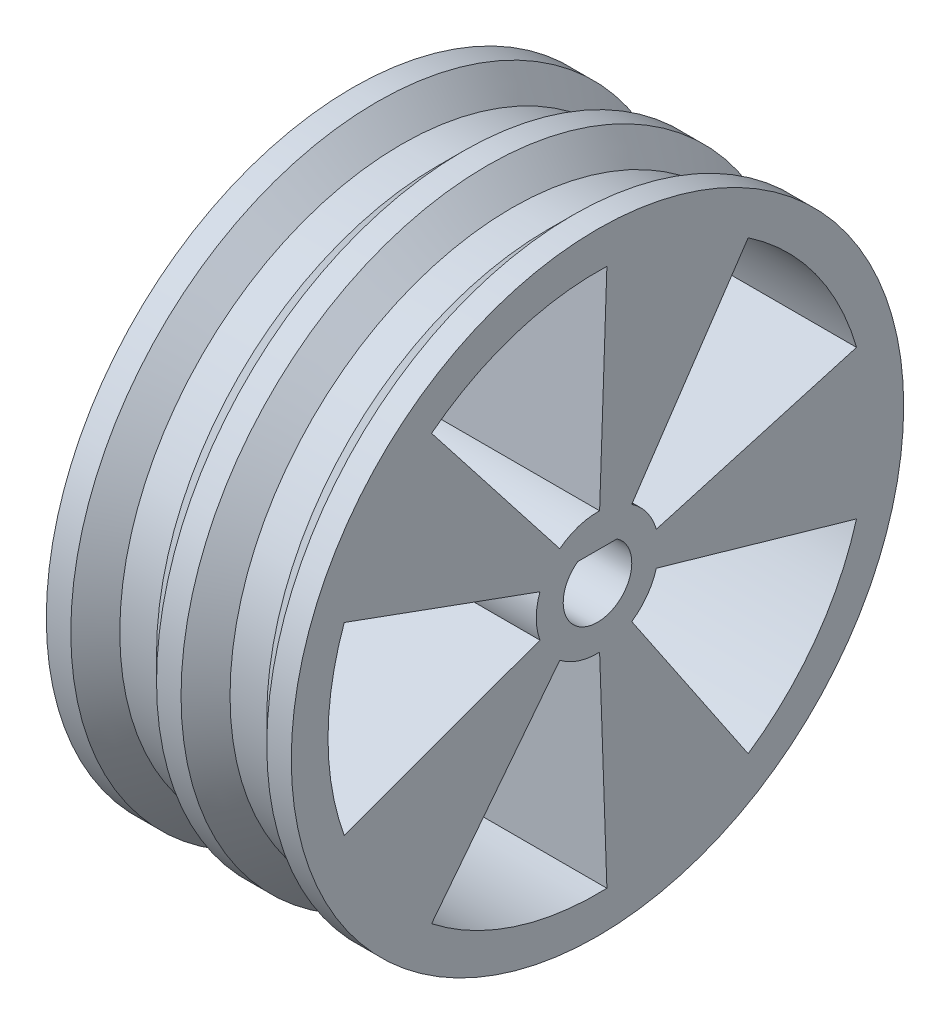
ISO-10303-21;
HEADER;
FILE_DESCRIPTION(('STEP AP214'),'2;1');
FILE_NAME('part.step','',(''),(''),'','','');
FILE_SCHEMA(('AUTOMOTIVE_DESIGN { 1 0 10303 214 1 1 1 1 }'));
ENDSEC;
DATA;
#1=APPLICATION_CONTEXT('core data for automotive mechanical design processes');
#2=APPLICATION_PROTOCOL_DEFINITION('international standard','automotive_design',2000,#1);
#3=PRODUCT_CONTEXT('',#1,'mechanical');
#4=PRODUCT('Part','Part','',(#3));
#5=PRODUCT_RELATED_PRODUCT_CATEGORY('part','',(#4));
#6=PRODUCT_DEFINITION_FORMATION('','',#4);
#7=PRODUCT_DEFINITION_CONTEXT('part definition',#1,'design');
#8=PRODUCT_DEFINITION('design','',#6,#7);
#9=PRODUCT_DEFINITION_SHAPE('','',#8);
#10=(LENGTH_UNIT() NAMED_UNIT(*) SI_UNIT(.MILLI.,.METRE.));
#11=(NAMED_UNIT(*) PLANE_ANGLE_UNIT() SI_UNIT($,.RADIAN.));
#12=(NAMED_UNIT(*) SI_UNIT($,.STERADIAN.) SOLID_ANGLE_UNIT());
#13=UNCERTAINTY_MEASURE_WITH_UNIT(LENGTH_MEASURE(1.E-05),#10,'distance_accuracy_value','');
#14=(GEOMETRIC_REPRESENTATION_CONTEXT(3) GLOBAL_UNCERTAINTY_ASSIGNED_CONTEXT((#13)) GLOBAL_UNIT_ASSIGNED_CONTEXT((#10,
#11,#12)) REPRESENTATION_CONTEXT('',''));
#15=CARTESIAN_POINT('',(0.,0.,0.));
#16=DIRECTION('',(0.,0.,1.));
#17=DIRECTION('',(1.,0.,0.));
#18=AXIS2_PLACEMENT_3D('',#15,#16,#17);
#19=CARTESIAN_POINT('',(-10.,0.,0.));
#20=DIRECTION('',(1.,0.,0.));
#21=DIRECTION('',(0.,0.,-1.));
#22=AXIS2_PLACEMENT_3D('',#19,#20,#21);
#23=CYLINDRICAL_SURFACE('',#22,2.8);
#24=CARTESIAN_POINT('',(-6.,0.,0.));
#25=DIRECTION('',(-1.,0.,0.));
#26=DIRECTION('',(0.,0.,1.));
#27=AXIS2_PLACEMENT_3D('',#24,#25,#26);
#28=CIRCLE('',#27,2.8);
#29=CARTESIAN_POINT('',(-6.,2.3,1.59687194226713));
#30=VERTEX_POINT('',#29);
#31=CARTESIAN_POINT('',(-6.,2.3,-1.59687194226713));
#32=VERTEX_POINT('',#31);
#33=EDGE_CURVE('E97',#30,#32,#28,.F.);
#34=ORIENTED_EDGE('',*,*,#33,.F.);
#35=DIRECTION('',(1.,0.,0.));
#36=VECTOR('',#35,1.);
#37=CARTESIAN_POINT('',(-10.,2.3,1.59687194226713));
#38=LINE('',#37,#36);
#39=CARTESIAN_POINT('',(10.,2.3,1.59687194226713));
#40=VERTEX_POINT('',#39);
#41=EDGE_CURVE('E239',#30,#40,#38,.T.);
#42=ORIENTED_EDGE('',*,*,#41,.T.);
#43=CARTESIAN_POINT('',(10.,0.,0.));
#44=DIRECTION('',(1.,0.,0.));
#45=DIRECTION('',(0.,0.,-1.));
#46=AXIS2_PLACEMENT_3D('',#43,#44,#45);
#47=CIRCLE('',#46,2.8);
#48=CARTESIAN_POINT('',(10.,2.3,-1.59687194226713));
#49=VERTEX_POINT('',#48);
#50=EDGE_CURVE('E387',#40,#49,#47,.T.);
#51=ORIENTED_EDGE('',*,*,#50,.T.);
#52=DIRECTION('',(1.,0.,0.));
#53=VECTOR('',#52,1.);
#54=CARTESIAN_POINT('',(-10.,2.3,-1.59687194226713));
#55=LINE('',#54,#53);
#56=EDGE_CURVE('E241',#32,#49,#55,.T.);
#57=ORIENTED_EDGE('',*,*,#56,.F.);
#58=EDGE_LOOP('',(#34,#42,#51,#57));
#59=FACE_BOUND('',#58,.T.);
#60=ADVANCED_FACE('F83',(#59),#23,.F.);
#61=CARTESIAN_POINT('',(-10.,2.3,1.59687194226713));
#62=DIRECTION('',(0.,1.,0.));
#63=DIRECTION('',(0.,0.,1.));
#64=AXIS2_PLACEMENT_3D('',#61,#62,#63);
#65=PLANE('',#64);
#66=DIRECTION('',(0.,0.,1.));
#67=VECTOR('',#66,1.);
#68=CARTESIAN_POINT('',(-6.,2.3,1.59687194226713));
#69=LINE('',#68,#67);
#70=EDGE_CURVE('E229',#32,#30,#69,.T.);
#71=ORIENTED_EDGE('',*,*,#70,.F.);
#72=ORIENTED_EDGE('',*,*,#56,.T.);
#73=DIRECTION('',(0.,0.,1.));
#74=VECTOR('',#73,1.);
#75=CARTESIAN_POINT('',(10.,2.3,1.59687194226713));
#76=LINE('',#75,#74);
#77=EDGE_CURVE('E247',#49,#40,#76,.T.);
#78=ORIENTED_EDGE('',*,*,#77,.T.);
#79=ORIENTED_EDGE('',*,*,#41,.F.);
#80=EDGE_LOOP('',(#71,#72,#78,#79));
#81=FACE_BOUND('',#80,.T.);
#82=ADVANCED_FACE('F245',(#81),#65,.F.);
#83=CARTESIAN_POINT('',(-10.,0.,0.));
#84=DIRECTION('',(1.,0.,0.));
#85=DIRECTION('',(0.,0.,-1.));
#86=AXIS2_PLACEMENT_3D('',#83,#84,#85);
#87=PLANE('',#86);
#88=CARTESIAN_POINT('',(-10.,0.,0.));
#89=DIRECTION('',(-1.,0.,0.));
#90=DIRECTION('',(0.,0.,1.));
#91=AXIS2_PLACEMENT_3D('',#88,#89,#90);
#92=CIRCLE('',#91,3.);
#93=CARTESIAN_POINT('',(-10.,0.,3.));
#94=VERTEX_POINT('',#93);
#95=EDGE_CURVE('E729',#94,#94,#92,.T.);
#96=ORIENTED_EDGE('',*,*,#95,.F.);
#97=EDGE_LOOP('',(#96));
#98=FACE_BOUND('',#97,.T.);
#99=CARTESIAN_POINT('',(-10.,0.,0.));
#100=DIRECTION('',(1.,0.,0.));
#101=DIRECTION('',(0.,0.,-1.));
#102=AXIS2_PLACEMENT_3D('',#99,#100,#101);
#103=CIRCLE('',#102,5.);
#104=CARTESIAN_POINT('',(-10.,-4.99695413509548,-0.174497483512452));
#105=VERTEX_POINT('',#104);
#106=CARTESIAN_POINT('',(-10.,-3.94005376803357,3.07830737662834));
#107=VERTEX_POINT('',#106);
#108=EDGE_CURVE('E736',#105,#107,#103,.F.);
#109=ORIENTED_EDGE('',*,*,#108,.T.);
#110=DIRECTION('',(0.,0.788010753606723,-0.615661475325657));
#111=VECTOR('',#110,1.);
#112=CARTESIAN_POINT('',(-10.,0.,0.));
#113=LINE('',#112,#111);
#114=CARTESIAN_POINT('',(-10.,-17.3362365793479,13.5445524571645));
#115=VERTEX_POINT('',#114);
#116=EDGE_CURVE('E740',#115,#107,#113,.T.);
#117=ORIENTED_EDGE('',*,*,#116,.F.);
#118=CARTESIAN_POINT('',(-10.,0.,0.));
#119=DIRECTION('',(1.,0.,0.));
#120=DIRECTION('',(0.,0.,-1.));
#121=AXIS2_PLACEMENT_3D('',#118,#119,#120);
#122=CIRCLE('',#121,22.);
#123=CARTESIAN_POINT('',(-10.,-21.9865981944201,-0.767788927455052));
#124=VERTEX_POINT('',#123);
#125=EDGE_CURVE('E742',#124,#115,#122,.F.);
#126=ORIENTED_EDGE('',*,*,#125,.F.);
#127=DIRECTION('',(0.,0.999390827019096,0.0348994967025059));
#128=VECTOR('',#127,1.);
#129=CARTESIAN_POINT('',(-10.,0.,0.));
#130=LINE('',#129,#128);
#131=EDGE_CURVE('E733',#124,#105,#130,.T.);
#132=ORIENTED_EDGE('',*,*,#131,.T.);
#133=EDGE_LOOP('',(#109,#117,#126,#132));
#134=FACE_BOUND('',#133,.T.);
#135=CARTESIAN_POINT('',(-10.,0.,0.));
#136=DIRECTION('',(1.,0.,0.));
#137=DIRECTION('',(0.,0.,-1.));
#138=AXIS2_PLACEMENT_3D('',#135,#136,#137);
#139=CIRCLE('',#138,5.);
#140=CARTESIAN_POINT('',(-10.,-1.37818677908506,-4.8063084796917));
#141=VERTEX_POINT('',#140);
#142=CARTESIAN_POINT('',(-10.,-4.14518786277518,-2.79596451735377));
#143=VERTEX_POINT('',#142);
#144=EDGE_CURVE('E762',#141,#143,#139,.F.);
#145=ORIENTED_EDGE('',*,*,#144,.T.);
#146=DIRECTION('',(0.,0.829037572555044,0.559192903470743));
#147=VECTOR('',#146,1.);
#148=CARTESIAN_POINT('',(-10.,0.,0.));
#149=LINE('',#148,#147);
#150=CARTESIAN_POINT('',(-10.,-18.2388265962109,-12.3022438763564));
#151=VERTEX_POINT('',#150);
#152=EDGE_CURVE('E766',#151,#143,#149,.T.);
#153=ORIENTED_EDGE('',*,*,#152,.F.);
#154=CARTESIAN_POINT('',(-10.,0.,0.));
#155=DIRECTION('',(1.,0.,0.));
#156=DIRECTION('',(0.,0.,-1.));
#157=AXIS2_PLACEMENT_3D('',#154,#155,#156);
#158=CIRCLE('',#157,22.);
#159=CARTESIAN_POINT('',(-10.,-6.06402182797396,-21.147757310643));
#160=VERTEX_POINT('',#159);
#161=EDGE_CURVE('E768',#160,#151,#158,.F.);
#162=ORIENTED_EDGE('',*,*,#161,.F.);
#163=DIRECTION('',(0.,0.275637355816996,0.96126169593832));
#164=VECTOR('',#163,1.);
#165=CARTESIAN_POINT('',(-10.,0.,0.));
#166=LINE('',#165,#164);
#167=EDGE_CURVE('E759',#160,#141,#166,.T.);
#168=ORIENTED_EDGE('',*,*,#167,.T.);
#169=EDGE_LOOP('',(#145,#153,#162,#168));
#170=FACE_BOUND('',#169,.T.);
#171=CARTESIAN_POINT('',(-10.,0.,0.));
#172=DIRECTION('',(1.,0.,0.));
#173=DIRECTION('',(0.,0.,-1.));
#174=AXIS2_PLACEMENT_3D('',#171,#172,#173);
#175=CIRCLE('',#174,5.);
#176=CARTESIAN_POINT('',(-10.,4.14518786277522,-2.79596451735385));
#177=VERTEX_POINT('',#176);
#178=CARTESIAN_POINT('',(-10.,1.37818677908497,-4.8063084796916));
#179=VERTEX_POINT('',#178);
#180=EDGE_CURVE('E790',#177,#179,#175,.F.);
#181=ORIENTED_EDGE('',*,*,#180,.T.);
#182=DIRECTION('',(0.,-0.275637355816999,0.961261695938319));
#183=VECTOR('',#182,1.);
#184=CARTESIAN_POINT('',(-10.,0.,0.));
#185=LINE('',#184,#183);
#186=CARTESIAN_POINT('',(-10.,6.06402182797396,-21.147757310643));
#187=VERTEX_POINT('',#186);
#188=EDGE_CURVE('E794',#187,#179,#185,.T.);
#189=ORIENTED_EDGE('',*,*,#188,.F.);
#190=CARTESIAN_POINT('',(-10.,0.,0.));
#191=DIRECTION('',(1.,0.,0.));
#192=DIRECTION('',(0.,0.,-1.));
#193=AXIS2_PLACEMENT_3D('',#190,#191,#192);
#194=CIRCLE('',#193,22.);
#195=CARTESIAN_POINT('',(-10.,18.2388265962109,-12.3022438763564));
#196=VERTEX_POINT('',#195);
#197=EDGE_CURVE('E429',#196,#187,#194,.F.);
#198=ORIENTED_EDGE('',*,*,#197,.F.);
#199=DIRECTION('',(0.,-0.829037572555046,0.559192903470741));
#200=VECTOR('',#199,1.);
#201=CARTESIAN_POINT('',(-10.,0.,-1.04985018589199E-13));
#202=LINE('',#201,#200);
#203=EDGE_CURVE('E787',#196,#177,#202,.T.);
#204=ORIENTED_EDGE('',*,*,#203,.T.);
#205=EDGE_LOOP('',(#181,#189,#198,#204));
#206=FACE_BOUND('',#205,.T.);
#207=CARTESIAN_POINT('',(-10.,0.,0.));
#208=DIRECTION('',(1.,0.,0.));
#209=DIRECTION('',(0.,0.,-1.));
#210=AXIS2_PLACEMENT_3D('',#207,#208,#209);
#211=CIRCLE('',#210,5.);
#212=CARTESIAN_POINT('',(-10.,3.9400537680336,3.0783073766283));
#213=VERTEX_POINT('',#212);
#214=CARTESIAN_POINT('',(-10.,4.99695413509548,-0.174497483512522));
#215=VERTEX_POINT('',#214);
#216=EDGE_CURVE('E417',#213,#215,#211,.F.);
#217=ORIENTED_EDGE('',*,*,#216,.T.);
#218=DIRECTION('',(0.,-0.999390827019096,0.0348994967025015));
#219=VECTOR('',#218,1.);
#220=CARTESIAN_POINT('',(-10.,0.,0.));
#221=LINE('',#220,#219);
#222=CARTESIAN_POINT('',(-10.,21.9865981944201,-0.767788927455048));
#223=VERTEX_POINT('',#222);
#224=EDGE_CURVE('E412',#223,#215,#221,.T.);
#225=ORIENTED_EDGE('',*,*,#224,.F.);
#226=CARTESIAN_POINT('',(-10.,0.,0.));
#227=DIRECTION('',(1.,0.,0.));
#228=DIRECTION('',(0.,0.,-1.));
#229=AXIS2_PLACEMENT_3D('',#226,#227,#228);
#230=CIRCLE('',#229,22.);
#231=CARTESIAN_POINT('',(-10.,17.3362365793479,13.5445524571645));
#232=VERTEX_POINT('',#231);
#233=EDGE_CURVE('E408',#232,#223,#230,.F.);
#234=ORIENTED_EDGE('',*,*,#233,.F.);
#235=DIRECTION('',(0.,-0.788010753606721,-0.615661475325659));
#236=VECTOR('',#235,1.);
#237=CARTESIAN_POINT('',(-10.,0.,0.));
#238=LINE('',#237,#236);
#239=EDGE_CURVE('E423',#232,#213,#238,.T.);
#240=ORIENTED_EDGE('',*,*,#239,.T.);
#241=EDGE_LOOP('',(#217,#225,#234,#240));
#242=FACE_BOUND('',#241,.T.);
#243=CARTESIAN_POINT('',(-10.,0.,0.));
#244=DIRECTION('',(1.,0.,0.));
#245=DIRECTION('',(0.,0.,-1.));
#246=AXIS2_PLACEMENT_3D('',#243,#244,#245);
#247=CIRCLE('',#246,25.);
#248=CARTESIAN_POINT('',(-10.,0.,-25.));
#249=VERTEX_POINT('',#248);
#250=EDGE_CURVE('E235',#249,#249,#247,.T.);
#251=ORIENTED_EDGE('',*,*,#250,.F.);
#252=EDGE_LOOP('',(#251));
#253=FACE_BOUND('',#252,.T.);
#254=DIRECTION('',(0.,0.34202014332567,-0.939692620785908));
#255=VECTOR('',#254,1.);
#256=CARTESIAN_POINT('',(-10.,0.,0.));
#257=LINE('',#256,#255);
#258=CARTESIAN_POINT('',(-10.,-7.52444315316474,20.67323765729));
#259=VERTEX_POINT('',#258);
#260=CARTESIAN_POINT('',(-10.,-1.71010071662835,4.69846310392954));
#261=VERTEX_POINT('',#260);
#262=EDGE_CURVE('E370',#259,#261,#257,.T.);
#263=ORIENTED_EDGE('',*,*,#262,.T.);
#264=CARTESIAN_POINT('',(-10.,0.,0.));
#265=DIRECTION('',(1.,0.,0.));
#266=DIRECTION('',(0.,0.,-1.));
#267=AXIS2_PLACEMENT_3D('',#264,#265,#266);
#268=CIRCLE('',#267,5.);
#269=CARTESIAN_POINT('',(-10.,1.71010071662835,4.69846310392954));
#270=VERTEX_POINT('',#269);
#271=EDGE_CURVE('E378',#261,#270,#268,.F.);
#272=ORIENTED_EDGE('',*,*,#271,.T.);
#273=DIRECTION('',(0.,-0.34202014332567,-0.939692620785908));
#274=VECTOR('',#273,1.);
#275=CARTESIAN_POINT('',(-10.,0.,0.));
#276=LINE('',#275,#274);
#277=CARTESIAN_POINT('',(-10.,7.52444315316474,20.67323765729));
#278=VERTEX_POINT('',#277);
#279=EDGE_CURVE('E404',#278,#270,#276,.T.);
#280=ORIENTED_EDGE('',*,*,#279,.F.);
#281=CARTESIAN_POINT('',(-10.,0.,0.));
#282=DIRECTION('',(1.,0.,0.));
#283=DIRECTION('',(0.,0.,-1.));
#284=AXIS2_PLACEMENT_3D('',#281,#282,#283);
#285=CIRCLE('',#284,22.);
#286=EDGE_CURVE('E385',#259,#278,#285,.F.);
#287=ORIENTED_EDGE('',*,*,#286,.F.);
#288=EDGE_LOOP('',(#263,#272,#280,#287));
#289=FACE_BOUND('',#288,.T.);
#290=ADVANCED_FACE('F280',(#98,#134,#170,#206,#242,#253,#289),#87,.F.);
#291=CARTESIAN_POINT('',(10.,0.,0.));
#292=DIRECTION('',(1.,0.,0.));
#293=DIRECTION('',(0.,0.,-1.));
#294=AXIS2_PLACEMENT_3D('',#291,#292,#293);
#295=PLANE('',#294);
#296=DIRECTION('',(0.,-0.788010753606723,0.615661475325657));
#297=VECTOR('',#296,1.);
#298=CARTESIAN_POINT('',(10.,0.,0.));
#299=LINE('',#298,#297);
#300=CARTESIAN_POINT('',(10.,-3.94005376803357,3.07830737662834));
#301=VERTEX_POINT('',#300);
#302=CARTESIAN_POINT('',(10.,-17.3362365793479,13.5445524571645));
#303=VERTEX_POINT('',#302);
#304=EDGE_CURVE('E242',#301,#303,#299,.T.);
#305=ORIENTED_EDGE('',*,*,#304,.F.);
#306=CARTESIAN_POINT('',(10.,0.,0.));
#307=DIRECTION('',(1.,0.,0.));
#308=DIRECTION('',(0.,0.,-1.));
#309=AXIS2_PLACEMENT_3D('',#306,#307,#308);
#310=CIRCLE('',#309,5.);
#311=CARTESIAN_POINT('',(10.,-4.99695413509548,-0.174497483512452));
#312=VERTEX_POINT('',#311);
#313=EDGE_CURVE('E749',#301,#312,#310,.T.);
#314=ORIENTED_EDGE('',*,*,#313,.T.);
#315=DIRECTION('',(0.,-0.999390827019096,-0.0348994967025059));
#316=VECTOR('',#315,1.);
#317=CARTESIAN_POINT('',(10.,0.,0.));
#318=LINE('',#317,#316);
#319=CARTESIAN_POINT('',(10.,-21.9865981944201,-0.767788927455052));
#320=VERTEX_POINT('',#319);
#321=EDGE_CURVE('E746',#312,#320,#318,.T.);
#322=ORIENTED_EDGE('',*,*,#321,.T.);
#323=CARTESIAN_POINT('',(10.,0.,0.));
#324=DIRECTION('',(1.,0.,0.));
#325=DIRECTION('',(0.,0.,-1.));
#326=AXIS2_PLACEMENT_3D('',#323,#324,#325);
#327=CIRCLE('',#326,22.);
#328=EDGE_CURVE('E744',#303,#320,#327,.T.);
#329=ORIENTED_EDGE('',*,*,#328,.F.);
#330=EDGE_LOOP('',(#305,#314,#322,#329));
#331=FACE_BOUND('',#330,.T.);
#332=DIRECTION('',(0.,-0.829037572555044,-0.559192903470743));
#333=VECTOR('',#332,1.);
#334=CARTESIAN_POINT('',(10.,0.,0.));
#335=LINE('',#334,#333);
#336=CARTESIAN_POINT('',(10.,-4.14518786277528,-2.79596451735384));
#337=VERTEX_POINT('',#336);
#338=CARTESIAN_POINT('',(10.,-18.2388265962109,-12.3022438763564));
#339=VERTEX_POINT('',#338);
#340=EDGE_CURVE('E334',#337,#339,#335,.T.);
#341=ORIENTED_EDGE('',*,*,#340,.F.);
#342=CARTESIAN_POINT('',(10.,0.,0.));
#343=DIRECTION('',(1.,0.,0.));
#344=DIRECTION('',(0.,0.,-1.));
#345=AXIS2_PLACEMENT_3D('',#342,#343,#344);
#346=CIRCLE('',#345,5.);
#347=CARTESIAN_POINT('',(10.,-1.37818677908506,-4.8063084796917));
#348=VERTEX_POINT('',#347);
#349=EDGE_CURVE('E776',#337,#348,#346,.T.);
#350=ORIENTED_EDGE('',*,*,#349,.T.);
#351=DIRECTION('',(0.,-0.275637355816996,-0.96126169593832));
#352=VECTOR('',#351,1.);
#353=CARTESIAN_POINT('',(10.,0.,0.));
#354=LINE('',#353,#352);
#355=CARTESIAN_POINT('',(10.,-6.06402182797396,-21.147757310643));
#356=VERTEX_POINT('',#355);
#357=EDGE_CURVE('E773',#348,#356,#354,.T.);
#358=ORIENTED_EDGE('',*,*,#357,.T.);
#359=CARTESIAN_POINT('',(10.,0.,0.));
#360=DIRECTION('',(1.,0.,0.));
#361=DIRECTION('',(0.,0.,-1.));
#362=AXIS2_PLACEMENT_3D('',#359,#360,#361);
#363=CIRCLE('',#362,22.);
#364=EDGE_CURVE('E770',#339,#356,#363,.T.);
#365=ORIENTED_EDGE('',*,*,#364,.F.);
#366=EDGE_LOOP('',(#341,#350,#358,#365));
#367=FACE_BOUND('',#366,.T.);
#368=DIRECTION('',(0.,0.275637355816999,-0.961261695938319));
#369=VECTOR('',#368,1.);
#370=CARTESIAN_POINT('',(10.,0.,0.));
#371=LINE('',#370,#369);
#372=CARTESIAN_POINT('',(10.,1.378186779085,-4.80630847969172));
#373=VERTEX_POINT('',#372);
#374=CARTESIAN_POINT('',(10.,6.06402182797396,-21.147757310643));
#375=VERTEX_POINT('',#374);
#376=EDGE_CURVE('E339',#373,#375,#371,.T.);
#377=ORIENTED_EDGE('',*,*,#376,.F.);
#378=CARTESIAN_POINT('',(10.,0.,0.));
#379=DIRECTION('',(1.,0.,0.));
#380=DIRECTION('',(0.,0.,-1.));
#381=AXIS2_PLACEMENT_3D('',#378,#379,#380);
#382=CIRCLE('',#381,5.);
#383=CARTESIAN_POINT('',(10.,4.14518786277522,-2.79596451735385));
#384=VERTEX_POINT('',#383);
#385=EDGE_CURVE('E803',#373,#384,#382,.T.);
#386=ORIENTED_EDGE('',*,*,#385,.T.);
#387=DIRECTION('',(0.,0.829037572555046,-0.559192903470741));
#388=VECTOR('',#387,1.);
#389=CARTESIAN_POINT('',(10.,0.,-1.04985018589199E-13));
#390=LINE('',#389,#388);
#391=CARTESIAN_POINT('',(10.,18.2388265962109,-12.3022438763564));
#392=VERTEX_POINT('',#391);
#393=EDGE_CURVE('E800',#384,#392,#390,.T.);
#394=ORIENTED_EDGE('',*,*,#393,.T.);
#395=CARTESIAN_POINT('',(10.,0.,0.));
#396=DIRECTION('',(1.,0.,0.));
#397=DIRECTION('',(0.,0.,-1.));
#398=AXIS2_PLACEMENT_3D('',#395,#396,#397);
#399=CIRCLE('',#398,22.);
#400=EDGE_CURVE('E797',#375,#392,#399,.T.);
#401=ORIENTED_EDGE('',*,*,#400,.F.);
#402=EDGE_LOOP('',(#377,#386,#394,#401));
#403=FACE_BOUND('',#402,.T.);
#404=DIRECTION('',(0.,0.999390827019096,-0.0348994967025015));
#405=VECTOR('',#404,1.);
#406=CARTESIAN_POINT('',(10.,0.,0.));
#407=LINE('',#406,#405);
#408=CARTESIAN_POINT('',(10.,4.99695413509548,-0.174497483512522));
#409=VERTEX_POINT('',#408);
#410=CARTESIAN_POINT('',(10.,21.9865981944201,-0.767788927455049));
#411=VERTEX_POINT('',#410);
#412=EDGE_CURVE('E344',#409,#411,#407,.T.);
#413=ORIENTED_EDGE('',*,*,#412,.F.);
#414=CARTESIAN_POINT('',(10.,0.,0.));
#415=DIRECTION('',(1.,0.,0.));
#416=DIRECTION('',(0.,0.,-1.));
#417=AXIS2_PLACEMENT_3D('',#414,#415,#416);
#418=CIRCLE('',#417,5.);
#419=CARTESIAN_POINT('',(10.,3.9400537680336,3.0783073766283));
#420=VERTEX_POINT('',#419);
#421=EDGE_CURVE('E435',#409,#420,#418,.T.);
#422=ORIENTED_EDGE('',*,*,#421,.T.);
#423=DIRECTION('',(0.,0.788010753606721,0.615661475325659));
#424=VECTOR('',#423,1.);
#425=CARTESIAN_POINT('',(10.,0.,0.));
#426=LINE('',#425,#424);
#427=CARTESIAN_POINT('',(10.,17.3362365793479,13.5445524571645));
#428=VERTEX_POINT('',#427);
#429=EDGE_CURVE('E432',#420,#428,#426,.T.);
#430=ORIENTED_EDGE('',*,*,#429,.T.);
#431=CARTESIAN_POINT('',(10.,0.,0.));
#432=DIRECTION('',(1.,0.,0.));
#433=DIRECTION('',(0.,0.,-1.));
#434=AXIS2_PLACEMENT_3D('',#431,#432,#433);
#435=CIRCLE('',#434,22.);
#436=EDGE_CURVE('E428',#411,#428,#435,.T.);
#437=ORIENTED_EDGE('',*,*,#436,.F.);
#438=EDGE_LOOP('',(#413,#422,#430,#437));
#439=FACE_BOUND('',#438,.T.);
#440=CARTESIAN_POINT('',(10.,0.,0.));
#441=DIRECTION('',(1.,0.,0.));
#442=DIRECTION('',(0.,0.,-1.));
#443=AXIS2_PLACEMENT_3D('',#440,#441,#442);
#444=CIRCLE('',#443,25.);
#445=CARTESIAN_POINT('',(10.,0.,-25.));
#446=VERTEX_POINT('',#445);
#447=EDGE_CURVE('E252',#446,#446,#444,.T.);
#448=ORIENTED_EDGE('',*,*,#447,.T.);
#449=EDGE_LOOP('',(#448));
#450=FACE_BOUND('',#449,.T.);
#451=ORIENTED_EDGE('',*,*,#77,.F.);
#452=ORIENTED_EDGE('',*,*,#50,.F.);
#453=EDGE_LOOP('',(#451,#452));
#454=FACE_BOUND('',#453,.T.);
#455=CARTESIAN_POINT('',(10.,0.,0.));
#456=DIRECTION('',(1.,0.,0.));
#457=DIRECTION('',(0.,0.,-1.));
#458=AXIS2_PLACEMENT_3D('',#455,#456,#457);
#459=CIRCLE('',#458,5.);
#460=CARTESIAN_POINT('',(10.,1.71010071662835,4.69846310392954));
#461=VERTEX_POINT('',#460);
#462=CARTESIAN_POINT('',(10.,-1.71010071662835,4.69846310392954));
#463=VERTEX_POINT('',#462);
#464=EDGE_CURVE('E353',#461,#463,#459,.T.);
#465=ORIENTED_EDGE('',*,*,#464,.T.);
#466=DIRECTION('',(0.,-0.34202014332567,0.939692620785908));
#467=VECTOR('',#466,1.);
#468=CARTESIAN_POINT('',(10.,0.,0.));
#469=LINE('',#468,#467);
#470=CARTESIAN_POINT('',(10.,-7.52444315316474,20.67323765729));
#471=VERTEX_POINT('',#470);
#472=EDGE_CURVE('E356',#463,#471,#469,.T.);
#473=ORIENTED_EDGE('',*,*,#472,.T.);
#474=CARTESIAN_POINT('',(10.,0.,0.));
#475=DIRECTION('',(1.,0.,0.));
#476=DIRECTION('',(0.,0.,-1.));
#477=AXIS2_PLACEMENT_3D('',#474,#475,#476);
#478=CIRCLE('',#477,22.);
#479=CARTESIAN_POINT('',(10.,7.52444315316474,20.67323765729));
#480=VERTEX_POINT('',#479);
#481=EDGE_CURVE('E363',#480,#471,#478,.T.);
#482=ORIENTED_EDGE('',*,*,#481,.F.);
#483=DIRECTION('',(0.,0.34202014332567,0.939692620785908));
#484=VECTOR('',#483,1.);
#485=CARTESIAN_POINT('',(10.,0.,0.));
#486=LINE('',#485,#484);
#487=EDGE_CURVE('E357',#461,#480,#486,.T.);
#488=ORIENTED_EDGE('',*,*,#487,.F.);
#489=EDGE_LOOP('',(#465,#473,#482,#488));
#490=FACE_BOUND('',#489,.T.);
#491=ADVANCED_FACE('F286',(#331,#367,#403,#439,#450,#454,#490),#295,.T.);
#492=CARTESIAN_POINT('',(-10.,0.,0.));
#493=DIRECTION('',(1.,0.,0.));
#494=DIRECTION('',(0.,0.,-1.));
#495=AXIS2_PLACEMENT_3D('',#492,#493,#494);
#496=CYLINDRICAL_SURFACE('',#495,25.);
#497=CARTESIAN_POINT('',(-1.,0.,0.));
#498=DIRECTION('',(-1.,0.,0.));
#499=DIRECTION('',(0.,0.,1.));
#500=AXIS2_PLACEMENT_3D('',#497,#498,#499);
#501=CIRCLE('',#500,25.);
#502=CARTESIAN_POINT('',(-1.,0.,25.));
#503=VERTEX_POINT('',#502);
#504=EDGE_CURVE('E307',#503,#503,#501,.T.);
#505=ORIENTED_EDGE('',*,*,#504,.F.);
#506=EDGE_LOOP('',(#505));
#507=FACE_BOUND('',#506,.T.);
#508=CARTESIAN_POINT('',(1.,0.,0.));
#509=DIRECTION('',(-1.,0.,0.));
#510=DIRECTION('',(0.,0.,1.));
#511=AXIS2_PLACEMENT_3D('',#508,#509,#510);
#512=CIRCLE('',#511,25.);
#513=CARTESIAN_POINT('',(1.,0.,25.));
#514=VERTEX_POINT('',#513);
#515=EDGE_CURVE('E379',#514,#514,#512,.T.);
#516=ORIENTED_EDGE('',*,*,#515,.T.);
#517=EDGE_LOOP('',(#516));
#518=FACE_BOUND('',#517,.T.);
#519=ADVANCED_FACE('F294',(#507,#518),#496,.T.);
#520=CARTESIAN_POINT('',(8.,0.,0.));
#521=DIRECTION('',(-1.,0.,0.));
#522=DIRECTION('',(0.,0.,1.));
#523=AXIS2_PLACEMENT_3D('',#520,#521,#522);
#524=CIRCLE('',#523,25.);
#525=CARTESIAN_POINT('',(8.,0.,25.));
#526=VERTEX_POINT('',#525);
#527=EDGE_CURVE('E383',#526,#526,#524,.T.);
#528=ORIENTED_EDGE('',*,*,#527,.F.);
#529=EDGE_LOOP('',(#528));
#530=FACE_BOUND('',#529,.T.);
#531=ORIENTED_EDGE('',*,*,#447,.F.);
#532=EDGE_LOOP('',(#531));
#533=FACE_BOUND('',#532,.T.);
#534=ADVANCED_FACE('F292',(#530,#533),#496,.T.);
#535=CARTESIAN_POINT('',(-8.,0.,0.));
#536=DIRECTION('',(-1.,0.,0.));
#537=DIRECTION('',(0.,0.,1.));
#538=AXIS2_PLACEMENT_3D('',#535,#536,#537);
#539=CIRCLE('',#538,25.);
#540=CARTESIAN_POINT('',(-8.,0.,25.));
#541=VERTEX_POINT('',#540);
#542=EDGE_CURVE('E382',#541,#541,#539,.T.);
#543=ORIENTED_EDGE('',*,*,#542,.T.);
#544=EDGE_LOOP('',(#543));
#545=FACE_BOUND('',#544,.T.);
#546=ORIENTED_EDGE('',*,*,#250,.T.);
#547=EDGE_LOOP('',(#546));
#548=FACE_BOUND('',#547,.T.);
#549=ADVANCED_FACE('F288',(#545,#548),#496,.T.);
#550=CARTESIAN_POINT('',(-1.,0.,0.));
#551=DIRECTION('',(-1.,0.,0.));
#552=DIRECTION('',(0.,0.,1.));
#553=AXIS2_PLACEMENT_3D('',#550,#551,#552);
#554=CYLINDRICAL_SURFACE('',#553,23.);
#555=CARTESIAN_POINT('',(-6.00000000000001,0.,0.));
#556=DIRECTION('',(-1.,0.,0.));
#557=DIRECTION('',(0.,0.,1.));
#558=AXIS2_PLACEMENT_3D('',#555,#556,#557);
#559=CIRCLE('',#558,23.);
#560=CARTESIAN_POINT('',(-6.00000000000001,0.,23.));
#561=VERTEX_POINT('',#560);
#562=EDGE_CURVE('E259',#561,#561,#559,.F.);
#563=ORIENTED_EDGE('',*,*,#562,.T.);
#564=EDGE_LOOP('',(#563));
#565=FACE_BOUND('',#564,.T.);
#566=CARTESIAN_POINT('',(-3.00000000000002,0.,0.));
#567=DIRECTION('',(-1.,0.,0.));
#568=DIRECTION('',(0.,0.,1.));
#569=AXIS2_PLACEMENT_3D('',#566,#567,#568);
#570=CIRCLE('',#569,23.);
#571=CARTESIAN_POINT('',(-3.00000000000002,0.,23.));
#572=VERTEX_POINT('',#571);
#573=EDGE_CURVE('E234',#572,#572,#570,.T.);
#574=ORIENTED_EDGE('',*,*,#573,.T.);
#575=EDGE_LOOP('',(#574));
#576=FACE_BOUND('',#575,.T.);
#577=ADVANCED_FACE('F291',(#565,#576),#554,.T.);
#578=CARTESIAN_POINT('',(1.,0.,0.));
#579=DIRECTION('',(1.,0.,0.));
#580=DIRECTION('',(0.,0.,-1.));
#581=AXIS2_PLACEMENT_3D('',#578,#579,#580);
#582=CYLINDRICAL_SURFACE('',#581,23.);
#583=CARTESIAN_POINT('',(2.99999999999999,0.,0.));
#584=DIRECTION('',(1.,0.,0.));
#585=DIRECTION('',(0.,0.,-1.));
#586=AXIS2_PLACEMENT_3D('',#583,#584,#585);
#587=CIRCLE('',#586,23.);
#588=CARTESIAN_POINT('',(2.99999999999999,0.,-23.));
#589=VERTEX_POINT('',#588);
#590=EDGE_CURVE('E12',#589,#589,#587,.T.);
#591=ORIENTED_EDGE('',*,*,#590,.T.);
#592=EDGE_LOOP('',(#591));
#593=FACE_BOUND('',#592,.T.);
#594=CARTESIAN_POINT('',(5.99999999999999,0.,0.));
#595=DIRECTION('',(1.,0.,0.));
#596=DIRECTION('',(0.,0.,-1.));
#597=AXIS2_PLACEMENT_3D('',#594,#595,#596);
#598=CIRCLE('',#597,23.);
#599=CARTESIAN_POINT('',(5.99999999999999,0.,-23.));
#600=VERTEX_POINT('',#599);
#601=EDGE_CURVE('E91',#600,#600,#598,.F.);
#602=ORIENTED_EDGE('',*,*,#601,.T.);
#603=EDGE_LOOP('',(#602));
#604=FACE_BOUND('',#603,.T.);
#605=ADVANCED_FACE('F264',(#593,#604),#582,.T.);
#606=CARTESIAN_POINT('',(-34.9212654929615,0.,0.));
#607=DIRECTION('',(0.,0.939692620785908,0.34202014332567));
#608=DIRECTION('',(0.,-0.34202014332567,0.939692620785908));
#609=AXIS2_PLACEMENT_3D('',#606,#607,#608);
#610=PLANE('',#609);
#611=DIRECTION('',(1.,0.,0.));
#612=VECTOR('',#611,1.);
#613=CARTESIAN_POINT('',(-34.9212654929615,-7.52444315316474,20.67323765729));
#614=LINE('',#613,#612);
#615=EDGE_CURVE('E361',#259,#471,#614,.T.);
#616=ORIENTED_EDGE('',*,*,#615,.T.);
#617=ORIENTED_EDGE('',*,*,#472,.F.);
#618=DIRECTION('',(1.,0.,0.));
#619=VECTOR('',#618,1.);
#620=CARTESIAN_POINT('',(-34.9212654929615,-1.71010071662835,4.69846310392954));
#621=LINE('',#620,#619);
#622=EDGE_CURVE('E373',#261,#463,#621,.T.);
#623=ORIENTED_EDGE('',*,*,#622,.F.);
#624=ORIENTED_EDGE('',*,*,#262,.F.);
#625=EDGE_LOOP('',(#616,#617,#623,#624));
#626=FACE_BOUND('',#625,.T.);
#627=ADVANCED_FACE('F316',(#626),#610,.T.);
#628=CARTESIAN_POINT('',(-34.9212654929615,0.,0.));
#629=DIRECTION('',(1.,0.,0.));
#630=DIRECTION('',(0.,0.,-1.));
#631=AXIS2_PLACEMENT_3D('',#628,#629,#630);
#632=CYLINDRICAL_SURFACE('',#631,5.);
#633=ORIENTED_EDGE('',*,*,#622,.T.);
#634=ORIENTED_EDGE('',*,*,#464,.F.);
#635=DIRECTION('',(1.,0.,0.));
#636=VECTOR('',#635,1.);
#637=CARTESIAN_POINT('',(-34.9212654929615,1.71010071662835,4.69846310392954));
#638=LINE('',#637,#636);
#639=EDGE_CURVE('E371',#270,#461,#638,.T.);
#640=ORIENTED_EDGE('',*,*,#639,.F.);
#641=ORIENTED_EDGE('',*,*,#271,.F.);
#642=EDGE_LOOP('',(#633,#634,#640,#641));
#643=FACE_BOUND('',#642,.T.);
#644=ADVANCED_FACE('F403',(#643),#632,.T.);
#645=CARTESIAN_POINT('',(-34.9212654929615,0.,0.));
#646=DIRECTION('',(0.,0.939692620785908,-0.34202014332567));
#647=DIRECTION('',(0.,0.34202014332567,0.939692620785908));
#648=AXIS2_PLACEMENT_3D('',#645,#646,#647);
#649=PLANE('',#648);
#650=ORIENTED_EDGE('',*,*,#279,.T.);
#651=ORIENTED_EDGE('',*,*,#639,.T.);
#652=ORIENTED_EDGE('',*,*,#487,.T.);
#653=DIRECTION('',(1.,0.,0.));
#654=VECTOR('',#653,1.);
#655=CARTESIAN_POINT('',(-34.9212654929615,7.52444315316474,20.67323765729));
#656=LINE('',#655,#654);
#657=EDGE_CURVE('E367',#278,#480,#656,.T.);
#658=ORIENTED_EDGE('',*,*,#657,.F.);
#659=EDGE_LOOP('',(#650,#651,#652,#658));
#660=FACE_BOUND('',#659,.T.);
#661=ADVANCED_FACE('F463',(#660),#649,.F.);
#662=CARTESIAN_POINT('',(-34.9212654929615,0.,0.));
#663=DIRECTION('',(1.,0.,0.));
#664=DIRECTION('',(0.,0.,-1.));
#665=AXIS2_PLACEMENT_3D('',#662,#663,#664);
#666=CYLINDRICAL_SURFACE('',#665,22.);
#667=ORIENTED_EDGE('',*,*,#286,.T.);
#668=ORIENTED_EDGE('',*,*,#657,.T.);
#669=ORIENTED_EDGE('',*,*,#481,.T.);
#670=ORIENTED_EDGE('',*,*,#615,.F.);
#671=EDGE_LOOP('',(#667,#668,#669,#670));
#672=FACE_BOUND('',#671,.T.);
#673=ADVANCED_FACE('F456',(#672),#666,.F.);
#674=CARTESIAN_POINT('',(-34.9212654929615,0.,0.));
#675=DIRECTION('',(0.,-0.0348994967025015,-0.999390827019096));
#676=DIRECTION('',(0.,0.999390827019096,-0.0348994967025015));
#677=AXIS2_PLACEMENT_3D('',#674,#675,#676);
#678=PLANE('',#677);
#679=ORIENTED_EDGE('',*,*,#224,.T.);
#680=DIRECTION('',(1.,0.,0.));
#681=VECTOR('',#680,1.);
#682=CARTESIAN_POINT('',(-34.9212654929615,4.99695413509548,-0.174497483512522));
#683=LINE('',#682,#681);
#684=EDGE_CURVE('E438',#215,#409,#683,.T.);
#685=ORIENTED_EDGE('',*,*,#684,.T.);
#686=ORIENTED_EDGE('',*,*,#412,.T.);
#687=DIRECTION('',(1.,0.,0.));
#688=VECTOR('',#687,1.);
#689=CARTESIAN_POINT('',(-34.9212654929615,21.9865981944201,-0.767788927455049));
#690=LINE('',#689,#688);
#691=EDGE_CURVE('E437',#223,#411,#690,.T.);
#692=ORIENTED_EDGE('',*,*,#691,.F.);
#693=EDGE_LOOP('',(#679,#685,#686,#692));
#694=FACE_BOUND('',#693,.T.);
#695=ADVANCED_FACE('F454',(#694),#678,.F.);
#696=CARTESIAN_POINT('',(-34.9212654929615,0.,0.));
#697=DIRECTION('',(1.,0.,0.));
#698=DIRECTION('',(0.,0.,-1.));
#699=AXIS2_PLACEMENT_3D('',#696,#697,#698);
#700=CYLINDRICAL_SURFACE('',#699,5.);
#701=DIRECTION('',(1.,0.,0.));
#702=VECTOR('',#701,1.);
#703=CARTESIAN_POINT('',(-34.9212654929615,3.9400537680336,3.0783073766283));
#704=LINE('',#703,#702);
#705=EDGE_CURVE('E440',#213,#420,#704,.T.);
#706=ORIENTED_EDGE('',*,*,#705,.T.);
#707=ORIENTED_EDGE('',*,*,#421,.F.);
#708=ORIENTED_EDGE('',*,*,#684,.F.);
#709=ORIENTED_EDGE('',*,*,#216,.F.);
#710=EDGE_LOOP('',(#706,#707,#708,#709));
#711=FACE_BOUND('',#710,.T.);
#712=ADVANCED_FACE('F453',(#711),#700,.T.);
#713=CARTESIAN_POINT('',(-34.9212654929615,0.,0.));
#714=DIRECTION('',(0.,0.615661475325659,-0.788010753606721));
#715=DIRECTION('',(0.,0.788010753606721,0.615661475325659));
#716=AXIS2_PLACEMENT_3D('',#713,#714,#715);
#717=PLANE('',#716);
#718=DIRECTION('',(1.,0.,0.));
#719=VECTOR('',#718,1.);
#720=CARTESIAN_POINT('',(-34.9212654929615,17.3362365793479,13.5445524571645));
#721=LINE('',#720,#719);
#722=EDGE_CURVE('E442',#232,#428,#721,.T.);
#723=ORIENTED_EDGE('',*,*,#722,.T.);
#724=ORIENTED_EDGE('',*,*,#429,.F.);
#725=ORIENTED_EDGE('',*,*,#705,.F.);
#726=ORIENTED_EDGE('',*,*,#239,.F.);
#727=EDGE_LOOP('',(#723,#724,#725,#726));
#728=FACE_BOUND('',#727,.T.);
#729=ADVANCED_FACE('F448',(#728),#717,.T.);
#730=CARTESIAN_POINT('',(-34.9212654929615,0.,0.));
#731=DIRECTION('',(1.,0.,0.));
#732=DIRECTION('',(0.,0.,-1.));
#733=AXIS2_PLACEMENT_3D('',#730,#731,#732);
#734=CYLINDRICAL_SURFACE('',#733,22.);
#735=ORIENTED_EDGE('',*,*,#233,.T.);
#736=ORIENTED_EDGE('',*,*,#691,.T.);
#737=ORIENTED_EDGE('',*,*,#436,.T.);
#738=ORIENTED_EDGE('',*,*,#722,.F.);
#739=EDGE_LOOP('',(#735,#736,#737,#738));
#740=FACE_BOUND('',#739,.T.);
#741=ADVANCED_FACE('F443',(#740),#734,.F.);
#742=CARTESIAN_POINT('',(-34.9212654929615,0.,0.));
#743=DIRECTION('',(0.,-0.961261695938319,-0.275637355816999));
#744=DIRECTION('',(0.,0.275637355816999,-0.961261695938319));
#745=AXIS2_PLACEMENT_3D('',#742,#743,#744);
#746=PLANE('',#745);
#747=ORIENTED_EDGE('',*,*,#188,.T.);
#748=DIRECTION('',(1.,0.,0.));
#749=VECTOR('',#748,1.);
#750=CARTESIAN_POINT('',(-34.9212654929615,1.378186779085,-4.80630847969172));
#751=LINE('',#750,#749);
#752=EDGE_CURVE('E791',#179,#373,#751,.T.);
#753=ORIENTED_EDGE('',*,*,#752,.T.);
#754=ORIENTED_EDGE('',*,*,#376,.T.);
#755=DIRECTION('',(1.,0.,0.));
#756=VECTOR('',#755,1.);
#757=CARTESIAN_POINT('',(-34.9212654929615,6.06402182797396,-21.147757310643));
#758=LINE('',#757,#756);
#759=EDGE_CURVE('E805',#187,#375,#758,.T.);
#760=ORIENTED_EDGE('',*,*,#759,.F.);
#761=EDGE_LOOP('',(#747,#753,#754,#760));
#762=FACE_BOUND('',#761,.T.);
#763=ADVANCED_FACE('F515',(#762),#746,.F.);
#764=CARTESIAN_POINT('',(-34.9212654929615,0.,0.));
#765=DIRECTION('',(1.,0.,0.));
#766=DIRECTION('',(0.,0.,-1.));
#767=AXIS2_PLACEMENT_3D('',#764,#765,#766);
#768=CYLINDRICAL_SURFACE('',#767,5.);
#769=DIRECTION('',(1.,0.,0.));
#770=VECTOR('',#769,1.);
#771=CARTESIAN_POINT('',(-34.9212654929615,4.14518786277522,-2.79596451735385));
#772=LINE('',#771,#770);
#773=EDGE_CURVE('E807',#177,#384,#772,.T.);
#774=ORIENTED_EDGE('',*,*,#773,.T.);
#775=ORIENTED_EDGE('',*,*,#385,.F.);
#776=ORIENTED_EDGE('',*,*,#752,.F.);
#777=ORIENTED_EDGE('',*,*,#180,.F.);
#778=EDGE_LOOP('',(#774,#775,#776,#777));
#779=FACE_BOUND('',#778,.T.);
#780=ADVANCED_FACE('F523',(#779),#768,.T.);
#781=CARTESIAN_POINT('',(-34.9212654929615,0.,-1.04985018589199E-13));
#782=DIRECTION('',(0.,-0.559192903470741,-0.829037572555046));
#783=DIRECTION('',(0.,0.829037572555046,-0.559192903470741));
#784=AXIS2_PLACEMENT_3D('',#781,#782,#783);
#785=PLANE('',#784);
#786=DIRECTION('',(1.,0.,0.));
#787=VECTOR('',#786,1.);
#788=CARTESIAN_POINT('',(-34.9212654929615,18.2388265962109,-12.3022438763564));
#789=LINE('',#788,#787);
#790=EDGE_CURVE('E809',#196,#392,#789,.T.);
#791=ORIENTED_EDGE('',*,*,#790,.T.);
#792=ORIENTED_EDGE('',*,*,#393,.F.);
#793=ORIENTED_EDGE('',*,*,#773,.F.);
#794=ORIENTED_EDGE('',*,*,#203,.F.);
#795=EDGE_LOOP('',(#791,#792,#793,#794));
#796=FACE_BOUND('',#795,.T.);
#797=ADVANCED_FACE('F533',(#796),#785,.T.);
#798=CARTESIAN_POINT('',(-34.9212654929615,0.,0.));
#799=DIRECTION('',(1.,0.,0.));
#800=DIRECTION('',(0.,0.,-1.));
#801=AXIS2_PLACEMENT_3D('',#798,#799,#800);
#802=CYLINDRICAL_SURFACE('',#801,22.);
#803=ORIENTED_EDGE('',*,*,#197,.T.);
#804=ORIENTED_EDGE('',*,*,#759,.T.);
#805=ORIENTED_EDGE('',*,*,#400,.T.);
#806=ORIENTED_EDGE('',*,*,#790,.F.);
#807=EDGE_LOOP('',(#803,#804,#805,#806));
#808=FACE_BOUND('',#807,.T.);
#809=ADVANCED_FACE('F543',(#808),#802,.F.);
#810=CARTESIAN_POINT('',(-34.9212654929615,0.,0.));
#811=DIRECTION('',(0.,-0.559192903470743,0.829037572555044));
#812=DIRECTION('',(0.,-0.829037572555044,-0.559192903470743));
#813=AXIS2_PLACEMENT_3D('',#810,#811,#812);
#814=PLANE('',#813);
#815=ORIENTED_EDGE('',*,*,#152,.T.);
#816=DIRECTION('',(1.,0.,0.));
#817=VECTOR('',#816,1.);
#818=CARTESIAN_POINT('',(-34.9212654929615,-4.14518786277528,-2.79596451735384));
#819=LINE('',#818,#817);
#820=EDGE_CURVE('E763',#143,#337,#819,.T.);
#821=ORIENTED_EDGE('',*,*,#820,.T.);
#822=ORIENTED_EDGE('',*,*,#340,.T.);
#823=DIRECTION('',(1.,0.,0.));
#824=VECTOR('',#823,1.);
#825=CARTESIAN_POINT('',(-34.9212654929615,-18.2388265962109,-12.3022438763564));
#826=LINE('',#825,#824);
#827=EDGE_CURVE('E778',#151,#339,#826,.T.);
#828=ORIENTED_EDGE('',*,*,#827,.F.);
#829=EDGE_LOOP('',(#815,#821,#822,#828));
#830=FACE_BOUND('',#829,.T.);
#831=ADVANCED_FACE('F553',(#830),#814,.F.);
#832=CARTESIAN_POINT('',(-34.9212654929615,0.,0.));
#833=DIRECTION('',(1.,0.,0.));
#834=DIRECTION('',(0.,0.,-1.));
#835=AXIS2_PLACEMENT_3D('',#832,#833,#834);
#836=CYLINDRICAL_SURFACE('',#835,5.);
#837=DIRECTION('',(1.,0.,0.));
#838=VECTOR('',#837,1.);
#839=CARTESIAN_POINT('',(-34.9212654929615,-1.37818677908506,-4.8063084796917));
#840=LINE('',#839,#838);
#841=EDGE_CURVE('E780',#141,#348,#840,.T.);
#842=ORIENTED_EDGE('',*,*,#841,.T.);
#843=ORIENTED_EDGE('',*,*,#349,.F.);
#844=ORIENTED_EDGE('',*,*,#820,.F.);
#845=ORIENTED_EDGE('',*,*,#144,.F.);
#846=EDGE_LOOP('',(#842,#843,#844,#845));
#847=FACE_BOUND('',#846,.T.);
#848=ADVANCED_FACE('F563',(#847),#836,.T.);
#849=CARTESIAN_POINT('',(-34.9212654929615,0.,0.));
#850=DIRECTION('',(0.,-0.96126169593832,0.275637355816996));
#851=DIRECTION('',(0.,-0.275637355816996,-0.96126169593832));
#852=AXIS2_PLACEMENT_3D('',#849,#850,#851);
#853=PLANE('',#852);
#854=DIRECTION('',(1.,0.,0.));
#855=VECTOR('',#854,1.);
#856=CARTESIAN_POINT('',(-34.9212654929615,-6.06402182797396,-21.147757310643));
#857=LINE('',#856,#855);
#858=EDGE_CURVE('E782',#160,#356,#857,.T.);
#859=ORIENTED_EDGE('',*,*,#858,.T.);
#860=ORIENTED_EDGE('',*,*,#357,.F.);
#861=ORIENTED_EDGE('',*,*,#841,.F.);
#862=ORIENTED_EDGE('',*,*,#167,.F.);
#863=EDGE_LOOP('',(#859,#860,#861,#862));
#864=FACE_BOUND('',#863,.T.);
#865=ADVANCED_FACE('F573',(#864),#853,.T.);
#866=CARTESIAN_POINT('',(-34.9212654929615,0.,0.));
#867=DIRECTION('',(1.,0.,0.));
#868=DIRECTION('',(0.,0.,-1.));
#869=AXIS2_PLACEMENT_3D('',#866,#867,#868);
#870=CYLINDRICAL_SURFACE('',#869,22.);
#871=ORIENTED_EDGE('',*,*,#161,.T.);
#872=ORIENTED_EDGE('',*,*,#827,.T.);
#873=ORIENTED_EDGE('',*,*,#364,.T.);
#874=ORIENTED_EDGE('',*,*,#858,.F.);
#875=EDGE_LOOP('',(#871,#872,#873,#874));
#876=FACE_BOUND('',#875,.T.);
#877=ADVANCED_FACE('F583',(#876),#870,.F.);
#878=CARTESIAN_POINT('',(-34.9212654929615,0.,0.));
#879=DIRECTION('',(0.,0.615661475325657,0.788010753606723));
#880=DIRECTION('',(0.,-0.788010753606723,0.615661475325657));
#881=AXIS2_PLACEMENT_3D('',#878,#879,#880);
#882=PLANE('',#881);
#883=ORIENTED_EDGE('',*,*,#116,.T.);
#884=DIRECTION('',(1.,0.,0.));
#885=VECTOR('',#884,1.);
#886=CARTESIAN_POINT('',(-34.9212654929615,-3.94005376803357,3.07830737662834));
#887=LINE('',#886,#885);
#888=EDGE_CURVE('E737',#107,#301,#887,.T.);
#889=ORIENTED_EDGE('',*,*,#888,.T.);
#890=ORIENTED_EDGE('',*,*,#304,.T.);
#891=DIRECTION('',(1.,0.,0.));
#892=VECTOR('',#891,1.);
#893=CARTESIAN_POINT('',(-34.9212654929615,-17.3362365793479,13.5445524571645));
#894=LINE('',#893,#892);
#895=EDGE_CURVE('E751',#115,#303,#894,.T.);
#896=ORIENTED_EDGE('',*,*,#895,.F.);
#897=EDGE_LOOP('',(#883,#889,#890,#896));
#898=FACE_BOUND('',#897,.T.);
#899=ADVANCED_FACE('F593',(#898),#882,.F.);
#900=CARTESIAN_POINT('',(-34.9212654929615,0.,0.));
#901=DIRECTION('',(1.,0.,0.));
#902=DIRECTION('',(0.,0.,-1.));
#903=AXIS2_PLACEMENT_3D('',#900,#901,#902);
#904=CYLINDRICAL_SURFACE('',#903,5.);
#905=DIRECTION('',(1.,0.,0.));
#906=VECTOR('',#905,1.);
#907=CARTESIAN_POINT('',(-34.9212654929615,-4.99695413509548,-0.174497483512452));
#908=LINE('',#907,#906);
#909=EDGE_CURVE('E753',#105,#312,#908,.T.);
#910=ORIENTED_EDGE('',*,*,#909,.T.);
#911=ORIENTED_EDGE('',*,*,#313,.F.);
#912=ORIENTED_EDGE('',*,*,#888,.F.);
#913=ORIENTED_EDGE('',*,*,#108,.F.);
#914=EDGE_LOOP('',(#910,#911,#912,#913));
#915=FACE_BOUND('',#914,.T.);
#916=ADVANCED_FACE('F603',(#915),#904,.T.);
#917=CARTESIAN_POINT('',(-34.9212654929615,0.,0.));
#918=DIRECTION('',(0.,-0.0348994967025059,0.999390827019095));
#919=DIRECTION('',(0.,-0.999390827019096,-0.0348994967025059));
#920=AXIS2_PLACEMENT_3D('',#917,#918,#919);
#921=PLANE('',#920);
#922=DIRECTION('',(1.,0.,0.));
#923=VECTOR('',#922,1.);
#924=CARTESIAN_POINT('',(-34.9212654929615,-21.9865981944201,-0.767788927455052));
#925=LINE('',#924,#923);
#926=EDGE_CURVE('E105',#124,#320,#925,.T.);
#927=ORIENTED_EDGE('',*,*,#926,.T.);
#928=ORIENTED_EDGE('',*,*,#321,.F.);
#929=ORIENTED_EDGE('',*,*,#909,.F.);
#930=ORIENTED_EDGE('',*,*,#131,.F.);
#931=EDGE_LOOP('',(#927,#928,#929,#930));
#932=FACE_BOUND('',#931,.T.);
#933=ADVANCED_FACE('F613',(#932),#921,.T.);
#934=CARTESIAN_POINT('',(-34.9212654929615,0.,0.));
#935=DIRECTION('',(1.,0.,0.));
#936=DIRECTION('',(0.,0.,-1.));
#937=AXIS2_PLACEMENT_3D('',#934,#935,#936);
#938=CYLINDRICAL_SURFACE('',#937,22.);
#939=ORIENTED_EDGE('',*,*,#125,.T.);
#940=ORIENTED_EDGE('',*,*,#895,.T.);
#941=ORIENTED_EDGE('',*,*,#328,.T.);
#942=ORIENTED_EDGE('',*,*,#926,.F.);
#943=EDGE_LOOP('',(#939,#940,#941,#942));
#944=FACE_BOUND('',#943,.T.);
#945=ADVANCED_FACE('F623',(#944),#938,.F.);
#946=CARTESIAN_POINT('',(-6.,0.,0.));
#947=DIRECTION('',(-1.,0.,0.));
#948=DIRECTION('',(0.,0.,1.));
#949=AXIS2_PLACEMENT_3D('',#946,#947,#948);
#950=PLANE('',#949);
#951=CARTESIAN_POINT('',(-6.,0.,0.));
#952=DIRECTION('',(-1.,0.,0.));
#953=DIRECTION('',(0.,0.,1.));
#954=AXIS2_PLACEMENT_3D('',#951,#952,#953);
#955=CIRCLE('',#954,3.);
#956=CARTESIAN_POINT('',(-6.,0.,3.));
#957=VERTEX_POINT('',#956);
#958=EDGE_CURVE('E243',#957,#957,#955,.T.);
#959=ORIENTED_EDGE('',*,*,#958,.T.);
#960=EDGE_LOOP('',(#959));
#961=FACE_BOUND('',#960,.T.);
#962=ORIENTED_EDGE('',*,*,#33,.T.);
#963=ORIENTED_EDGE('',*,*,#70,.T.);
#964=EDGE_LOOP('',(#962,#963));
#965=FACE_BOUND('',#964,.T.);
#966=ADVANCED_FACE('F230',(#961,#965),#950,.T.);
#967=CARTESIAN_POINT('',(-6.,0.,0.));
#968=DIRECTION('',(-1.,0.,0.));
#969=DIRECTION('',(0.,0.,1.));
#970=AXIS2_PLACEMENT_3D('',#967,#968,#969);
#971=CYLINDRICAL_SURFACE('',#970,3.);
#972=ORIENTED_EDGE('',*,*,#958,.F.);
#973=EDGE_LOOP('',(#972));
#974=FACE_BOUND('',#973,.T.);
#975=ORIENTED_EDGE('',*,*,#95,.T.);
#976=EDGE_LOOP('',(#975));
#977=FACE_BOUND('',#976,.T.);
#978=ADVANCED_FACE('F298',(#974,#977),#971,.F.);
#979=CARTESIAN_POINT('',(-8.,0.,0.));
#980=DIRECTION('',(-1.,0.,0.));
#981=DIRECTION('',(0.,0.,1.));
#982=AXIS2_PLACEMENT_3D('',#979,#980,#981);
#983=CONICAL_SURFACE('',#982,25.,0.785398163397453);
#984=ORIENTED_EDGE('',*,*,#562,.F.);
#985=EDGE_LOOP('',(#984));
#986=FACE_BOUND('',#985,.T.);
#987=ORIENTED_EDGE('',*,*,#542,.F.);
#988=EDGE_LOOP('',(#987));
#989=FACE_BOUND('',#988,.T.);
#990=ADVANCED_FACE('F295',(#986,#989),#983,.T.);
#991=CARTESIAN_POINT('',(-3.00000000000002,0.,0.));
#992=DIRECTION('',(1.,0.,0.));
#993=DIRECTION('',(0.,0.,-1.));
#994=AXIS2_PLACEMENT_3D('',#991,#992,#993);
#995=CONICAL_SURFACE('',#994,23.,0.785398163397446);
#996=ORIENTED_EDGE('',*,*,#504,.T.);
#997=EDGE_LOOP('',(#996));
#998=FACE_BOUND('',#997,.T.);
#999=ORIENTED_EDGE('',*,*,#573,.F.);
#1000=EDGE_LOOP('',(#999));
#1001=FACE_BOUND('',#1000,.T.);
#1002=ADVANCED_FACE('F272',(#998,#1001),#995,.T.);
#1003=CARTESIAN_POINT('',(1.,0.,0.));
#1004=DIRECTION('',(-1.,0.,0.));
#1005=DIRECTION('',(0.,0.,1.));
#1006=AXIS2_PLACEMENT_3D('',#1003,#1004,#1005);
#1007=CONICAL_SURFACE('',#1006,25.,0.785398163397453);
#1008=ORIENTED_EDGE('',*,*,#590,.F.);
#1009=EDGE_LOOP('',(#1008));
#1010=FACE_BOUND('',#1009,.T.);
#1011=ORIENTED_EDGE('',*,*,#515,.F.);
#1012=EDGE_LOOP('',(#1011));
#1013=FACE_BOUND('',#1012,.T.);
#1014=ADVANCED_FACE('F267',(#1010,#1013),#1007,.T.);
#1015=CARTESIAN_POINT('',(5.99999999999999,0.,0.));
#1016=DIRECTION('',(1.,0.,0.));
#1017=DIRECTION('',(0.,0.,-1.));
#1018=AXIS2_PLACEMENT_3D('',#1015,#1016,#1017);
#1019=CONICAL_SURFACE('',#1018,23.,0.785398163397442);
#1020=ORIENTED_EDGE('',*,*,#527,.T.);
#1021=EDGE_LOOP('',(#1020));
#1022=FACE_BOUND('',#1021,.T.);
#1023=ORIENTED_EDGE('',*,*,#601,.F.);
#1024=EDGE_LOOP('',(#1023));
#1025=FACE_BOUND('',#1024,.T.);
#1026=ADVANCED_FACE('F85',(#1022,#1025),#1019,.T.);
#1027=CLOSED_SHELL('',(#60,#82,#290,#491,#519,#534,#549,#577,#605,#627,#644,#661,#673,#695,#712,
#729,#741,#763,#780,#797,#809,#831,#848,#865,#877,#899,#916,#933,#945,#966,#978,#990,#1002,
#1014,#1026));
#1028=MANIFOLD_SOLID_BREP('B2',#1027);
#1029=ADVANCED_BREP_SHAPE_REPRESENTATION('',(#18,#1028),#14);
#1030=SHAPE_DEFINITION_REPRESENTATION(#9,#1029);
ENDSEC;
END-ISO-10303-21;
